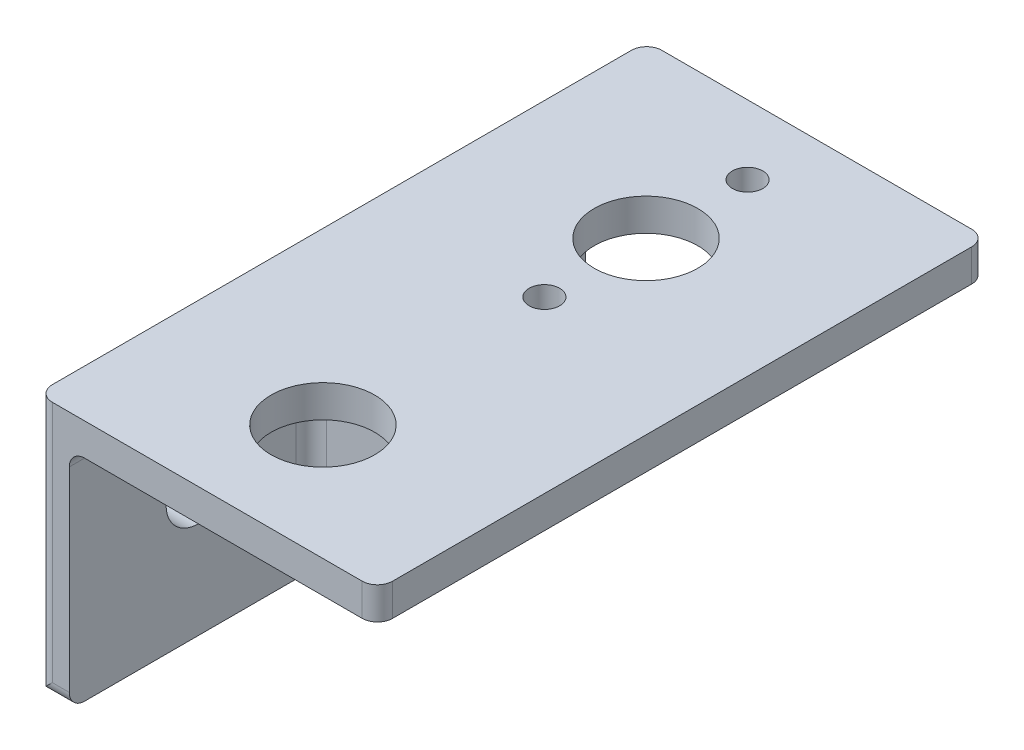
ISO-10303-21;
HEADER;
FILE_DESCRIPTION(('STEP AP214'),'2;1');
FILE_NAME('part.step','',(''),(''),'','','');
FILE_SCHEMA(('AUTOMOTIVE_DESIGN { 1 0 10303 214 1 1 1 1 }'));
ENDSEC;
DATA;
#1=APPLICATION_CONTEXT('core data for automotive mechanical design processes');
#2=APPLICATION_PROTOCOL_DEFINITION('international standard','automotive_design',2000,#1);
#3=PRODUCT_CONTEXT('',#1,'mechanical');
#4=PRODUCT('Part','Part','',(#3));
#5=PRODUCT_RELATED_PRODUCT_CATEGORY('part','',(#4));
#6=PRODUCT_DEFINITION_FORMATION('','',#4);
#7=PRODUCT_DEFINITION_CONTEXT('part definition',#1,'design');
#8=PRODUCT_DEFINITION('design','',#6,#7);
#9=PRODUCT_DEFINITION_SHAPE('','',#8);
#10=(LENGTH_UNIT() NAMED_UNIT(*) SI_UNIT(.MILLI.,.METRE.));
#11=(NAMED_UNIT(*) PLANE_ANGLE_UNIT() SI_UNIT($,.RADIAN.));
#12=(NAMED_UNIT(*) SI_UNIT($,.STERADIAN.) SOLID_ANGLE_UNIT());
#13=UNCERTAINTY_MEASURE_WITH_UNIT(LENGTH_MEASURE(1.E-05),#10,'distance_accuracy_value','');
#14=(GEOMETRIC_REPRESENTATION_CONTEXT(3) GLOBAL_UNCERTAINTY_ASSIGNED_CONTEXT((#13)) GLOBAL_UNIT_ASSIGNED_CONTEXT((#10,
#11,#12)) REPRESENTATION_CONTEXT('',''));
#15=CARTESIAN_POINT('',(0.,0.,0.));
#16=DIRECTION('',(0.,0.,1.));
#17=DIRECTION('',(1.,0.,0.));
#18=AXIS2_PLACEMENT_3D('',#15,#16,#17);
#19=CARTESIAN_POINT('',(3.175,0.,0.));
#20=DIRECTION('',(-1.,0.,0.));
#21=DIRECTION('',(0.,0.,1.));
#22=AXIS2_PLACEMENT_3D('',#19,#20,#21);
#23=PLANE('',#22);
#24=CARTESIAN_POINT('',(3.175,0.,12.7));
#25=DIRECTION('',(-1.,0.,0.));
#26=DIRECTION('',(0.,0.,1.));
#27=AXIS2_PLACEMENT_3D('',#24,#25,#26);
#28=CIRCLE('',#27,3.175);
#29=CARTESIAN_POINT('',(3.175,0.,15.875));
#30=VERTEX_POINT('',#29);
#31=EDGE_CURVE('E459',#30,#30,#28,.T.);
#32=ORIENTED_EDGE('',*,*,#31,.T.);
#33=EDGE_LOOP('',(#32));
#34=FACE_BOUND('',#33,.T.);
#35=DIRECTION('',(0.,-1.,0.));
#36=VECTOR('',#35,1.);
#37=CARTESIAN_POINT('',(3.175,-12.7,25.4));
#38=LINE('',#37,#36);
#39=CARTESIAN_POINT('',(3.175,8.02500000000001,25.4));
#40=VERTEX_POINT('',#39);
#41=CARTESIAN_POINT('',(3.175,-11.2,25.4));
#42=VERTEX_POINT('',#41);
#43=EDGE_CURVE('E221',#40,#42,#38,.T.);
#44=ORIENTED_EDGE('',*,*,#43,.T.);
#45=CARTESIAN_POINT('',(3.175,-11.2,23.9));
#46=DIRECTION('',(-1.,0.,0.));
#47=DIRECTION('',(0.,0.,1.));
#48=AXIS2_PLACEMENT_3D('',#45,#46,#47);
#49=CIRCLE('',#48,1.5);
#50=CARTESIAN_POINT('',(3.175,-12.7,23.9));
#51=VERTEX_POINT('',#50);
#52=EDGE_CURVE('E226',#42,#51,#49,.F.);
#53=ORIENTED_EDGE('',*,*,#52,.T.);
#54=DIRECTION('',(0.,0.,-1.));
#55=VECTOR('',#54,1.);
#56=CARTESIAN_POINT('',(3.175,-12.7,25.4));
#57=LINE('',#56,#55);
#58=CARTESIAN_POINT('',(3.175,-12.7,3.0875));
#59=VERTEX_POINT('',#58);
#60=EDGE_CURVE('E410',#51,#59,#57,.T.);
#61=ORIENTED_EDGE('',*,*,#60,.T.);
#62=DIRECTION('',(0.,-1.,0.));
#63=VECTOR('',#62,1.);
#64=CARTESIAN_POINT('',(3.175,9.52500000000001,3.0875));
#65=LINE('',#64,#63);
#66=CARTESIAN_POINT('',(3.175,8.02500000000001,3.0875));
#67=VERTEX_POINT('',#66);
#68=EDGE_CURVE('E223',#59,#67,#65,.F.);
#69=ORIENTED_EDGE('',*,*,#68,.T.);
#70=DIRECTION('',(0.,0.,-1.));
#71=VECTOR('',#70,1.);
#72=CARTESIAN_POINT('',(3.175,8.02500000000001,25.4));
#73=LINE('',#72,#71);
#74=EDGE_CURVE('E219',#67,#40,#73,.F.);
#75=ORIENTED_EDGE('',*,*,#74,.T.);
#76=EDGE_LOOP('',(#44,#53,#61,#69,#75));
#77=FACE_BOUND('',#76,.T.);
#78=ADVANCED_FACE('F33',(#34,#77),#23,.F.);
#79=CARTESIAN_POINT('',(0.,9.52500000000001,0.));
#80=DIRECTION('',(0.,1.,0.));
#81=DIRECTION('',(0.,0.,1.));
#82=AXIS2_PLACEMENT_3D('',#79,#80,#81);
#83=PLANE('',#82);
#84=CARTESIAN_POINT('',(16.75,9.52500000000001,14.0143792774836));
#85=DIRECTION('',(0.,1.,0.));
#86=DIRECTION('',(0.,0.,1.));
#87=AXIS2_PLACEMENT_3D('',#84,#85,#86);
#88=CIRCLE('',#87,5.1);
#89=CARTESIAN_POINT('',(16.75,9.52500000000001,19.1143792774836));
#90=VERTEX_POINT('',#89);
#91=EDGE_CURVE('E445',#90,#90,#88,.T.);
#92=ORIENTED_EDGE('',*,*,#91,.T.);
#93=EDGE_LOOP('',(#92));
#94=FACE_BOUND('',#93,.T.);
#95=CARTESIAN_POINT('',(16.75,9.52500000000001,-27.7881092855348));
#96=DIRECTION('',(0.,1.,0.));
#97=DIRECTION('',(0.,0.,1.));
#98=AXIS2_PLACEMENT_3D('',#95,#96,#97);
#99=CIRCLE('',#98,1.5);
#100=CARTESIAN_POINT('',(16.75,9.52500000000001,-26.2881092855348));
#101=VERTEX_POINT('',#100);
#102=EDGE_CURVE('E449',#101,#101,#99,.T.);
#103=ORIENTED_EDGE('',*,*,#102,.T.);
#104=EDGE_LOOP('',(#103));
#105=FACE_BOUND('',#104,.T.);
#106=CARTESIAN_POINT('',(16.75,9.52500000000001,-7.78810928553479));
#107=DIRECTION('',(0.,1.,0.));
#108=DIRECTION('',(0.,0.,1.));
#109=AXIS2_PLACEMENT_3D('',#106,#107,#108);
#110=CIRCLE('',#109,1.5);
#111=CARTESIAN_POINT('',(16.75,9.52500000000001,-6.28810928553479));
#112=VERTEX_POINT('',#111);
#113=EDGE_CURVE('E778',#112,#112,#110,.T.);
#114=ORIENTED_EDGE('',*,*,#113,.T.);
#115=EDGE_LOOP('',(#114));
#116=FACE_BOUND('',#115,.T.);
#117=CARTESIAN_POINT('',(16.75,9.52500000000001,-17.7881092855348));
#118=DIRECTION('',(0.,1.,0.));
#119=DIRECTION('',(0.,0.,1.));
#120=AXIS2_PLACEMENT_3D('',#117,#118,#119);
#121=CIRCLE('',#120,5.1);
#122=CARTESIAN_POINT('',(16.75,9.52500000000001,-12.6881092855348));
#123=VERTEX_POINT('',#122);
#124=EDGE_CURVE('E781',#123,#123,#121,.T.);
#125=ORIENTED_EDGE('',*,*,#124,.T.);
#126=EDGE_LOOP('',(#125));
#127=FACE_BOUND('',#126,.T.);
#128=DIRECTION('',(0.,0.,1.));
#129=VECTOR('',#128,1.);
#130=CARTESIAN_POINT('',(0.,9.52500000000001,-34.6));
#131=LINE('',#130,#129);
#132=CARTESIAN_POINT('',(0.,9.52500000000001,-33.1));
#133=VERTEX_POINT('',#132);
#134=CARTESIAN_POINT('',(0.,9.52500000000001,-25.4));
#135=VERTEX_POINT('',#134);
#136=EDGE_CURVE('E333',#133,#135,#131,.T.);
#137=ORIENTED_EDGE('',*,*,#136,.F.);
#138=CARTESIAN_POINT('',(1.5,9.52500000000001,-33.1));
#139=DIRECTION('',(0.,1.,0.));
#140=DIRECTION('',(0.,0.,1.));
#141=AXIS2_PLACEMENT_3D('',#138,#139,#140);
#142=CIRCLE('',#141,1.5);
#143=CARTESIAN_POINT('',(1.5,9.52500000000001,-34.6));
#144=VERTEX_POINT('',#143);
#145=EDGE_CURVE('E259',#133,#144,#142,.F.);
#146=ORIENTED_EDGE('',*,*,#145,.T.);
#147=DIRECTION('',(-1.,0.,0.));
#148=VECTOR('',#147,1.);
#149=CARTESIAN_POINT('',(0.,9.52500000000001,-34.6));
#150=LINE('',#149,#148);
#151=CARTESIAN_POINT('',(32.,9.52500000000001,-34.6));
#152=VERTEX_POINT('',#151);
#153=EDGE_CURVE('E402',#152,#144,#150,.T.);
#154=ORIENTED_EDGE('',*,*,#153,.F.);
#155=CARTESIAN_POINT('',(32.,9.52500000000001,-33.1));
#156=DIRECTION('',(0.,1.,0.));
#157=DIRECTION('',(0.,0.,1.));
#158=AXIS2_PLACEMENT_3D('',#155,#156,#157);
#159=CIRCLE('',#158,1.5);
#160=CARTESIAN_POINT('',(33.5,9.52500000000001,-33.1));
#161=VERTEX_POINT('',#160);
#162=EDGE_CURVE('E253',#152,#161,#159,.F.);
#163=ORIENTED_EDGE('',*,*,#162,.T.);
#164=DIRECTION('',(0.,0.,-1.));
#165=VECTOR('',#164,1.);
#166=CARTESIAN_POINT('',(33.5,9.52500000000001,-34.6));
#167=LINE('',#166,#165);
#168=CARTESIAN_POINT('',(33.5,9.52500000000001,23.9));
#169=VERTEX_POINT('',#168);
#170=EDGE_CURVE('E400',#169,#161,#167,.T.);
#171=ORIENTED_EDGE('',*,*,#170,.F.);
#172=CARTESIAN_POINT('',(32.,9.52500000000001,23.9));
#173=DIRECTION('',(0.,1.,0.));
#174=DIRECTION('',(0.,0.,1.));
#175=AXIS2_PLACEMENT_3D('',#172,#173,#174);
#176=CIRCLE('',#175,1.5);
#177=CARTESIAN_POINT('',(32.,9.52500000000001,25.4));
#178=VERTEX_POINT('',#177);
#179=EDGE_CURVE('E256',#169,#178,#176,.F.);
#180=ORIENTED_EDGE('',*,*,#179,.T.);
#181=DIRECTION('',(1.,0.,0.));
#182=VECTOR('',#181,1.);
#183=CARTESIAN_POINT('',(0.,9.52500000000001,25.4));
#184=LINE('',#183,#182);
#185=CARTESIAN_POINT('',(4.675,9.52500000000001,25.4));
#186=VERTEX_POINT('',#185);
#187=EDGE_CURVE('E348',#186,#178,#184,.T.);
#188=ORIENTED_EDGE('',*,*,#187,.F.);
#189=DIRECTION('',(0.,0.,-1.));
#190=VECTOR('',#189,1.);
#191=CARTESIAN_POINT('',(4.675,9.52500000000001,1.5875));
#192=LINE('',#191,#190);
#193=CARTESIAN_POINT('',(4.675,9.52500000000001,3.0875));
#194=VERTEX_POINT('',#193);
#195=EDGE_CURVE('E240',#186,#194,#192,.T.);
#196=ORIENTED_EDGE('',*,*,#195,.T.);
#197=DIRECTION('',(-1.,0.,0.));
#198=VECTOR('',#197,1.);
#199=CARTESIAN_POINT('',(25.3999999999999,9.52500000000001,3.0875));
#200=LINE('',#199,#198);
#201=CARTESIAN_POINT('',(26.0213203435596,9.52500000000001,3.0875));
#202=VERTEX_POINT('',#201);
#203=EDGE_CURVE('E145',#194,#202,#200,.F.);
#204=ORIENTED_EDGE('',*,*,#203,.T.);
#205=DIRECTION('',(0.,0.,-1.));
#206=VECTOR('',#205,1.);
#207=CARTESIAN_POINT('',(26.0213203435596,9.52500000000001,-1.5875));
#208=LINE('',#207,#206);
#209=CARTESIAN_POINT('',(26.0213203435596,9.52500000000001,-3.0875));
#210=VERTEX_POINT('',#209);
#211=EDGE_CURVE('E205',#202,#210,#208,.T.);
#212=ORIENTED_EDGE('',*,*,#211,.T.);
#213=DIRECTION('',(-1.,0.,0.));
#214=VECTOR('',#213,1.);
#215=CARTESIAN_POINT('',(0.,9.52500000000001,-3.0875));
#216=LINE('',#215,#214);
#217=CARTESIAN_POINT('',(4.675,9.52500000000001,-3.0875));
#218=VERTEX_POINT('',#217);
#219=EDGE_CURVE('E176',#210,#218,#216,.T.);
#220=ORIENTED_EDGE('',*,*,#219,.T.);
#221=DIRECTION('',(0.,0.,-1.));
#222=VECTOR('',#221,1.);
#223=CARTESIAN_POINT('',(4.675,9.52500000000001,-25.4));
#224=LINE('',#223,#222);
#225=CARTESIAN_POINT('',(4.675,9.52500000000001,-25.4));
#226=VERTEX_POINT('',#225);
#227=EDGE_CURVE('E250',#218,#226,#224,.T.);
#228=ORIENTED_EDGE('',*,*,#227,.T.);
#229=DIRECTION('',(-1.,0.,0.));
#230=VECTOR('',#229,1.);
#231=CARTESIAN_POINT('',(3.175,9.52500000000001,-25.4));
#232=LINE('',#231,#230);
#233=EDGE_CURVE('E347',#226,#135,#232,.T.);
#234=ORIENTED_EDGE('',*,*,#233,.T.);
#235=EDGE_LOOP('',(#137,#146,#154,#163,#171,#180,#188,#196,#204,#212,#220,#228,#234));
#236=FACE_BOUND('',#235,.T.);
#237=ADVANCED_FACE('F343',(#94,#105,#116,#127,#236),#83,.F.);
#238=CARTESIAN_POINT('',(3.175,-12.7,-25.4));
#239=DIRECTION('',(0.,0.,1.));
#240=DIRECTION('',(1.,0.,0.));
#241=AXIS2_PLACEMENT_3D('',#238,#239,#240);
#242=PLANE('',#241);
#243=DIRECTION('',(0.,1.,0.));
#244=VECTOR('',#243,1.);
#245=CARTESIAN_POINT('',(3.175,-12.7,-25.4));
#246=LINE('',#245,#244);
#247=CARTESIAN_POINT('',(3.175,-11.2,-25.4));
#248=VERTEX_POINT('',#247);
#249=CARTESIAN_POINT('',(3.175,8.02500000000001,-25.4));
#250=VERTEX_POINT('',#249);
#251=EDGE_CURVE('E236',#248,#250,#246,.T.);
#252=ORIENTED_EDGE('',*,*,#251,.F.);
#253=DIRECTION('',(-1.,0.,0.));
#254=VECTOR('',#253,1.);
#255=CARTESIAN_POINT('',(3.175,-11.2,-25.4));
#256=LINE('',#255,#254);
#257=CARTESIAN_POINT('',(0.,-11.2,-25.4));
#258=VERTEX_POINT('',#257);
#259=EDGE_CURVE('E281',#248,#258,#256,.T.);
#260=ORIENTED_EDGE('',*,*,#259,.T.);
#261=DIRECTION('',(0.,1.,0.));
#262=VECTOR('',#261,1.);
#263=CARTESIAN_POINT('',(0.,-12.7,-25.4));
#264=LINE('',#263,#262);
#265=EDGE_CURVE('E408',#258,#135,#264,.T.);
#266=ORIENTED_EDGE('',*,*,#265,.T.);
#267=ORIENTED_EDGE('',*,*,#233,.F.);
#268=CARTESIAN_POINT('',(4.675,8.02500000000001,-25.4));
#269=DIRECTION('',(0.,0.,1.));
#270=DIRECTION('',(1.,0.,0.));
#271=AXIS2_PLACEMENT_3D('',#268,#269,#270);
#272=CIRCLE('',#271,1.5);
#273=EDGE_CURVE('E190',#226,#250,#272,.T.);
#274=ORIENTED_EDGE('',*,*,#273,.T.);
#275=EDGE_LOOP('',(#252,#260,#266,#267,#274));
#276=FACE_BOUND('',#275,.T.);
#277=ADVANCED_FACE('F299',(#276),#242,.F.);
#278=CARTESIAN_POINT('',(3.175,0.,-12.7));
#279=DIRECTION('',(-1.,0.,0.));
#280=DIRECTION('',(0.,0.,1.));
#281=AXIS2_PLACEMENT_3D('',#278,#279,#280);
#282=CIRCLE('',#281,3.175);
#283=CARTESIAN_POINT('',(3.175,0.,-9.525));
#284=VERTEX_POINT('',#283);
#285=EDGE_CURVE('E395',#284,#284,#282,.T.);
#286=ORIENTED_EDGE('',*,*,#285,.T.);
#287=EDGE_LOOP('',(#286));
#288=FACE_BOUND('',#287,.T.);
#289=CARTESIAN_POINT('',(3.175,-12.7,-3.0875));
#290=VERTEX_POINT('',#289);
#291=CARTESIAN_POINT('',(3.175,-12.7,-23.9));
#292=VERTEX_POINT('',#291);
#293=EDGE_CURVE('E235',#290,#292,#57,.T.);
#294=ORIENTED_EDGE('',*,*,#293,.T.);
#295=CARTESIAN_POINT('',(3.175,-11.2,-23.9));
#296=DIRECTION('',(-1.,0.,0.));
#297=DIRECTION('',(0.,0.,1.));
#298=AXIS2_PLACEMENT_3D('',#295,#296,#297);
#299=CIRCLE('',#298,1.5);
#300=EDGE_CURVE('E288',#292,#248,#299,.F.);
#301=ORIENTED_EDGE('',*,*,#300,.T.);
#302=ORIENTED_EDGE('',*,*,#251,.T.);
#303=DIRECTION('',(0.,0.,-1.));
#304=VECTOR('',#303,1.);
#305=CARTESIAN_POINT('',(3.175,8.02500000000001,-1.5875));
#306=LINE('',#305,#304);
#307=CARTESIAN_POINT('',(3.175,8.02500000000001,-3.0875));
#308=VERTEX_POINT('',#307);
#309=EDGE_CURVE('E284',#250,#308,#306,.F.);
#310=ORIENTED_EDGE('',*,*,#309,.T.);
#311=DIRECTION('',(0.,-1.,0.));
#312=VECTOR('',#311,1.);
#313=CARTESIAN_POINT('',(3.175,0.,-3.0875));
#314=LINE('',#313,#312);
#315=EDGE_CURVE('E286',#308,#290,#314,.T.);
#316=ORIENTED_EDGE('',*,*,#315,.T.);
#317=EDGE_LOOP('',(#294,#301,#302,#310,#316));
#318=FACE_BOUND('',#317,.T.);
#319=ADVANCED_FACE('F294',(#288,#318),#23,.F.);
#320=CARTESIAN_POINT('',(3.175,12.7,25.4));
#321=DIRECTION('',(0.,-1.,0.));
#322=DIRECTION('',(0.,0.,-1.));
#323=AXIS2_PLACEMENT_3D('',#320,#321,#322);
#324=PLANE('',#323);
#325=CARTESIAN_POINT('',(16.75,12.7,14.0143792774836));
#326=DIRECTION('',(0.,1.,0.));
#327=DIRECTION('',(0.,0.,1.));
#328=AXIS2_PLACEMENT_3D('',#325,#326,#327);
#329=CIRCLE('',#328,5.1);
#330=CARTESIAN_POINT('',(16.75,12.7,19.1143792774836));
#331=VERTEX_POINT('',#330);
#332=EDGE_CURVE('E197',#331,#331,#329,.T.);
#333=ORIENTED_EDGE('',*,*,#332,.F.);
#334=EDGE_LOOP('',(#333));
#335=FACE_BOUND('',#334,.T.);
#336=CARTESIAN_POINT('',(16.75,12.7,-27.7881092855348));
#337=DIRECTION('',(0.,1.,0.));
#338=DIRECTION('',(0.,0.,1.));
#339=AXIS2_PLACEMENT_3D('',#336,#337,#338);
#340=CIRCLE('',#339,1.5);
#341=CARTESIAN_POINT('',(16.75,12.7,-26.2881092855348));
#342=VERTEX_POINT('',#341);
#343=EDGE_CURVE('E792',#342,#342,#340,.T.);
#344=ORIENTED_EDGE('',*,*,#343,.F.);
#345=EDGE_LOOP('',(#344));
#346=FACE_BOUND('',#345,.T.);
#347=CARTESIAN_POINT('',(16.75,12.7,-7.78810928553479));
#348=DIRECTION('',(0.,1.,0.));
#349=DIRECTION('',(0.,0.,1.));
#350=AXIS2_PLACEMENT_3D('',#347,#348,#349);
#351=CIRCLE('',#350,1.5);
#352=CARTESIAN_POINT('',(16.75,12.7,-6.28810928553479));
#353=VERTEX_POINT('',#352);
#354=EDGE_CURVE('E787',#353,#353,#351,.T.);
#355=ORIENTED_EDGE('',*,*,#354,.F.);
#356=EDGE_LOOP('',(#355));
#357=FACE_BOUND('',#356,.T.);
#358=CARTESIAN_POINT('',(16.75,12.7,-17.7881092855348));
#359=DIRECTION('',(0.,1.,0.));
#360=DIRECTION('',(0.,0.,1.));
#361=AXIS2_PLACEMENT_3D('',#358,#359,#360);
#362=CIRCLE('',#361,5.1);
#363=CARTESIAN_POINT('',(16.75,12.7,-12.6881092855348));
#364=VERTEX_POINT('',#363);
#365=EDGE_CURVE('E783',#364,#364,#362,.T.);
#366=ORIENTED_EDGE('',*,*,#365,.F.);
#367=EDGE_LOOP('',(#366));
#368=FACE_BOUND('',#367,.T.);
#369=DIRECTION('',(-1.,0.,0.));
#370=VECTOR('',#369,1.);
#371=CARTESIAN_POINT('',(0.,12.7,-34.6));
#372=LINE('',#371,#370);
#373=CARTESIAN_POINT('',(32.,12.7,-34.6));
#374=VERTEX_POINT('',#373);
#375=CARTESIAN_POINT('',(1.5,12.7,-34.6));
#376=VERTEX_POINT('',#375);
#377=EDGE_CURVE('E349',#374,#376,#372,.T.);
#378=ORIENTED_EDGE('',*,*,#377,.T.);
#379=CARTESIAN_POINT('',(1.5,12.7,-33.1));
#380=DIRECTION('',(0.,-1.,0.));
#381=DIRECTION('',(0.,0.,-1.));
#382=AXIS2_PLACEMENT_3D('',#379,#380,#381);
#383=CIRCLE('',#382,1.5);
#384=CARTESIAN_POINT('',(0.,12.7,-33.1));
#385=VERTEX_POINT('',#384);
#386=EDGE_CURVE('E318',#376,#385,#383,.F.);
#387=ORIENTED_EDGE('',*,*,#386,.T.);
#388=DIRECTION('',(0.,0.,1.));
#389=VECTOR('',#388,1.);
#390=CARTESIAN_POINT('',(0.,12.7,25.4));
#391=LINE('',#390,#389);
#392=CARTESIAN_POINT('',(0.,12.7,23.9));
#393=VERTEX_POINT('',#392);
#394=EDGE_CURVE('E337',#385,#393,#391,.T.);
#395=ORIENTED_EDGE('',*,*,#394,.T.);
#396=CARTESIAN_POINT('',(1.5,12.7,23.9));
#397=DIRECTION('',(0.,-1.,0.));
#398=DIRECTION('',(0.,0.,-1.));
#399=AXIS2_PLACEMENT_3D('',#396,#397,#398);
#400=CIRCLE('',#399,1.5);
#401=CARTESIAN_POINT('',(1.5,12.7,25.4));
#402=VERTEX_POINT('',#401);
#403=EDGE_CURVE('E361',#393,#402,#400,.F.);
#404=ORIENTED_EDGE('',*,*,#403,.T.);
#405=DIRECTION('',(-1.,0.,0.));
#406=VECTOR('',#405,1.);
#407=CARTESIAN_POINT('',(3.175,12.7,25.4));
#408=LINE('',#407,#406);
#409=CARTESIAN_POINT('',(32.,12.7,25.4));
#410=VERTEX_POINT('',#409);
#411=EDGE_CURVE('E368',#410,#402,#408,.T.);
#412=ORIENTED_EDGE('',*,*,#411,.F.);
#413=CARTESIAN_POINT('',(32.,12.7,23.9));
#414=DIRECTION('',(0.,-1.,0.));
#415=DIRECTION('',(0.,0.,-1.));
#416=AXIS2_PLACEMENT_3D('',#413,#414,#415);
#417=CIRCLE('',#416,1.5);
#418=CARTESIAN_POINT('',(33.5,12.7,23.9));
#419=VERTEX_POINT('',#418);
#420=EDGE_CURVE('E323',#410,#419,#417,.F.);
#421=ORIENTED_EDGE('',*,*,#420,.T.);
#422=DIRECTION('',(0.,0.,-1.));
#423=VECTOR('',#422,1.);
#424=CARTESIAN_POINT('',(33.5,12.7,-34.6));
#425=LINE('',#424,#423);
#426=CARTESIAN_POINT('',(33.5,12.7,-33.1));
#427=VERTEX_POINT('',#426);
#428=EDGE_CURVE('E381',#419,#427,#425,.T.);
#429=ORIENTED_EDGE('',*,*,#428,.T.);
#430=CARTESIAN_POINT('',(32.,12.7,-33.1));
#431=DIRECTION('',(0.,-1.,0.));
#432=DIRECTION('',(0.,0.,-1.));
#433=AXIS2_PLACEMENT_3D('',#430,#431,#432);
#434=CIRCLE('',#433,1.5);
#435=EDGE_CURVE('E365',#427,#374,#434,.F.);
#436=ORIENTED_EDGE('',*,*,#435,.T.);
#437=EDGE_LOOP('',(#378,#387,#395,#404,#412,#421,#429,#436));
#438=FACE_BOUND('',#437,.T.);
#439=ADVANCED_FACE('F380',(#335,#346,#357,#368,#438),#324,.F.);
#440=CARTESIAN_POINT('',(3.175,-12.7,25.4));
#441=DIRECTION('',(0.,0.,-1.));
#442=DIRECTION('',(-1.,0.,0.));
#443=AXIS2_PLACEMENT_3D('',#440,#441,#442);
#444=PLANE('',#443);
#445=ORIENTED_EDGE('',*,*,#187,.T.);
#446=DIRECTION('',(0.,1.,0.));
#447=VECTOR('',#446,1.);
#448=CARTESIAN_POINT('',(32.,12.7,25.4));
#449=LINE('',#448,#447);
#450=EDGE_CURVE('E265',#178,#410,#449,.T.);
#451=ORIENTED_EDGE('',*,*,#450,.T.);
#452=ORIENTED_EDGE('',*,*,#411,.T.);
#453=DIRECTION('',(0.,-1.,0.));
#454=VECTOR('',#453,1.);
#455=CARTESIAN_POINT('',(1.5,-12.7,25.4));
#456=LINE('',#455,#454);
#457=CARTESIAN_POINT('',(1.5,-11.2,25.4));
#458=VERTEX_POINT('',#457);
#459=EDGE_CURVE('E263',#402,#458,#456,.T.);
#460=ORIENTED_EDGE('',*,*,#459,.T.);
#461=DIRECTION('',(-1.,0.,0.));
#462=VECTOR('',#461,1.);
#463=CARTESIAN_POINT('',(3.175,-11.2,25.4));
#464=LINE('',#463,#462);
#465=EDGE_CURVE('E234',#458,#42,#464,.F.);
#466=ORIENTED_EDGE('',*,*,#465,.T.);
#467=ORIENTED_EDGE('',*,*,#43,.F.);
#468=CARTESIAN_POINT('',(4.675,8.02500000000001,25.4));
#469=DIRECTION('',(0.,0.,-1.));
#470=DIRECTION('',(-1.,0.,0.));
#471=AXIS2_PLACEMENT_3D('',#468,#469,#470);
#472=CIRCLE('',#471,1.5);
#473=EDGE_CURVE('E192',#40,#186,#472,.T.);
#474=ORIENTED_EDGE('',*,*,#473,.T.);
#475=EDGE_LOOP('',(#445,#451,#452,#460,#466,#467,#474));
#476=FACE_BOUND('',#475,.T.);
#477=ADVANCED_FACE('F230',(#476),#444,.F.);
#478=CARTESIAN_POINT('',(3.175,-12.7,25.4));
#479=DIRECTION('',(0.,1.,0.));
#480=DIRECTION('',(0.,0.,1.));
#481=AXIS2_PLACEMENT_3D('',#478,#479,#480);
#482=PLANE('',#481);
#483=ORIENTED_EDGE('',*,*,#60,.F.);
#484=DIRECTION('',(-1.,0.,0.));
#485=VECTOR('',#484,1.);
#486=CARTESIAN_POINT('',(3.175,-12.7,23.9));
#487=LINE('',#486,#485);
#488=CARTESIAN_POINT('',(0.,-12.7,23.9));
#489=VERTEX_POINT('',#488);
#490=EDGE_CURVE('E276',#51,#489,#487,.T.);
#491=ORIENTED_EDGE('',*,*,#490,.T.);
#492=DIRECTION('',(0.,0.,-1.));
#493=VECTOR('',#492,1.);
#494=CARTESIAN_POINT('',(0.,-12.7,25.4));
#495=LINE('',#494,#493);
#496=CARTESIAN_POINT('',(0.,-12.7,-23.9));
#497=VERTEX_POINT('',#496);
#498=EDGE_CURVE('E304',#489,#497,#495,.T.);
#499=ORIENTED_EDGE('',*,*,#498,.T.);
#500=DIRECTION('',(-1.,0.,0.));
#501=VECTOR('',#500,1.);
#502=CARTESIAN_POINT('',(3.175,-12.7,-23.9));
#503=LINE('',#502,#501);
#504=EDGE_CURVE('E274',#497,#292,#503,.F.);
#505=ORIENTED_EDGE('',*,*,#504,.T.);
#506=ORIENTED_EDGE('',*,*,#293,.F.);
#507=DIRECTION('',(0.,0.,-1.));
#508=VECTOR('',#507,1.);
#509=CARTESIAN_POINT('',(3.175,-12.7,1.5875));
#510=LINE('',#509,#508);
#511=EDGE_CURVE('E50',#59,#290,#510,.T.);
#512=ORIENTED_EDGE('',*,*,#511,.F.);
#513=EDGE_LOOP('',(#483,#491,#499,#505,#506,#512));
#514=FACE_BOUND('',#513,.T.);
#515=ADVANCED_FACE('F467',(#514),#482,.F.);
#516=CARTESIAN_POINT('',(0.,0.,0.));
#517=DIRECTION('',(-1.,0.,0.));
#518=DIRECTION('',(0.,0.,1.));
#519=AXIS2_PLACEMENT_3D('',#516,#517,#518);
#520=PLANE('',#519);
#521=CARTESIAN_POINT('',(0.,0.,-12.7));
#522=DIRECTION('',(-1.,0.,0.));
#523=DIRECTION('',(0.,0.,1.));
#524=AXIS2_PLACEMENT_3D('',#521,#522,#523);
#525=CIRCLE('',#524,3.175);
#526=CARTESIAN_POINT('',(0.,0.,-9.525));
#527=VERTEX_POINT('',#526);
#528=EDGE_CURVE('E456',#527,#527,#525,.T.);
#529=ORIENTED_EDGE('',*,*,#528,.F.);
#530=EDGE_LOOP('',(#529));
#531=FACE_BOUND('',#530,.T.);
#532=CARTESIAN_POINT('',(0.,0.,12.7));
#533=DIRECTION('',(-1.,0.,0.));
#534=DIRECTION('',(0.,0.,1.));
#535=AXIS2_PLACEMENT_3D('',#532,#533,#534);
#536=CIRCLE('',#535,3.175);
#537=CARTESIAN_POINT('',(0.,0.,15.875));
#538=VERTEX_POINT('',#537);
#539=EDGE_CURVE('E453',#538,#538,#536,.T.);
#540=ORIENTED_EDGE('',*,*,#539,.F.);
#541=EDGE_LOOP('',(#540));
#542=FACE_BOUND('',#541,.T.);
#543=ORIENTED_EDGE('',*,*,#394,.F.);
#544=DIRECTION('',(0.,1.,0.));
#545=VECTOR('',#544,1.);
#546=CARTESIAN_POINT('',(0.,0.,-33.1));
#547=LINE('',#546,#545);
#548=EDGE_CURVE('E245',#385,#133,#547,.F.);
#549=ORIENTED_EDGE('',*,*,#548,.T.);
#550=ORIENTED_EDGE('',*,*,#136,.T.);
#551=ORIENTED_EDGE('',*,*,#265,.F.);
#552=CARTESIAN_POINT('',(0.,-11.2,-23.9));
#553=DIRECTION('',(-1.,0.,0.));
#554=DIRECTION('',(0.,0.,1.));
#555=AXIS2_PLACEMENT_3D('',#552,#553,#554);
#556=CIRCLE('',#555,1.5);
#557=EDGE_CURVE('E309',#258,#497,#556,.T.);
#558=ORIENTED_EDGE('',*,*,#557,.T.);
#559=ORIENTED_EDGE('',*,*,#498,.F.);
#560=DIRECTION('',(0.,-1.,0.));
#561=VECTOR('',#560,1.);
#562=CARTESIAN_POINT('',(0.,12.7,23.9));
#563=LINE('',#562,#561);
#564=EDGE_CURVE('E317',#489,#393,#563,.F.);
#565=ORIENTED_EDGE('',*,*,#564,.T.);
#566=EDGE_LOOP('',(#543,#549,#550,#551,#558,#559,#565));
#567=FACE_BOUND('',#566,.T.);
#568=ADVANCED_FACE('F331',(#531,#542,#567),#520,.T.);
#569=CARTESIAN_POINT('',(0.,9.52500000000001,-34.6));
#570=DIRECTION('',(0.,0.,-1.));
#571=DIRECTION('',(-1.,0.,0.));
#572=AXIS2_PLACEMENT_3D('',#569,#570,#571);
#573=PLANE('',#572);
#574=ORIENTED_EDGE('',*,*,#153,.T.);
#575=DIRECTION('',(0.,1.,0.));
#576=VECTOR('',#575,1.);
#577=CARTESIAN_POINT('',(1.5,9.52500000000001,-34.6));
#578=LINE('',#577,#576);
#579=EDGE_CURVE('E354',#144,#376,#578,.T.);
#580=ORIENTED_EDGE('',*,*,#579,.T.);
#581=ORIENTED_EDGE('',*,*,#377,.F.);
#582=DIRECTION('',(0.,1.,0.));
#583=VECTOR('',#582,1.);
#584=CARTESIAN_POINT('',(32.,9.52500000000001,-34.6));
#585=LINE('',#584,#583);
#586=EDGE_CURVE('E362',#374,#152,#585,.F.);
#587=ORIENTED_EDGE('',*,*,#586,.T.);
#588=EDGE_LOOP('',(#574,#580,#581,#587));
#589=FACE_BOUND('',#588,.T.);
#590=ADVANCED_FACE('F433',(#589),#573,.T.);
#591=CARTESIAN_POINT('',(33.5,9.52500000000001,-34.6));
#592=DIRECTION('',(1.,0.,0.));
#593=DIRECTION('',(0.,0.,-1.));
#594=AXIS2_PLACEMENT_3D('',#591,#592,#593);
#595=PLANE('',#594);
#596=ORIENTED_EDGE('',*,*,#428,.F.);
#597=DIRECTION('',(0.,1.,0.));
#598=VECTOR('',#597,1.);
#599=CARTESIAN_POINT('',(33.5,9.52500000000001,23.9));
#600=LINE('',#599,#598);
#601=EDGE_CURVE('E271',#419,#169,#600,.F.);
#602=ORIENTED_EDGE('',*,*,#601,.T.);
#603=ORIENTED_EDGE('',*,*,#170,.T.);
#604=DIRECTION('',(0.,1.,0.));
#605=VECTOR('',#604,1.);
#606=CARTESIAN_POINT('',(33.5,9.52500000000001,-33.1));
#607=LINE('',#606,#605);
#608=EDGE_CURVE('E268',#161,#427,#607,.T.);
#609=ORIENTED_EDGE('',*,*,#608,.T.);
#610=EDGE_LOOP('',(#596,#602,#603,#609));
#611=FACE_BOUND('',#610,.T.);
#612=ADVANCED_FACE('F390',(#611),#595,.T.);
#613=CARTESIAN_POINT('',(3.175,0.,12.7));
#614=DIRECTION('',(-1.,0.,0.));
#615=DIRECTION('',(0.,0.,1.));
#616=AXIS2_PLACEMENT_3D('',#613,#614,#615);
#617=CYLINDRICAL_SURFACE('',#616,3.175);
#618=ORIENTED_EDGE('',*,*,#31,.F.);
#619=EDGE_LOOP('',(#618));
#620=FACE_BOUND('',#619,.T.);
#621=ORIENTED_EDGE('',*,*,#539,.T.);
#622=EDGE_LOOP('',(#621));
#623=FACE_BOUND('',#622,.T.);
#624=ADVANCED_FACE('F464',(#620,#623),#617,.F.);
#625=CARTESIAN_POINT('',(3.175,0.,-12.7));
#626=DIRECTION('',(-1.,0.,0.));
#627=DIRECTION('',(0.,0.,1.));
#628=AXIS2_PLACEMENT_3D('',#625,#626,#627);
#629=CYLINDRICAL_SURFACE('',#628,3.175);
#630=ORIENTED_EDGE('',*,*,#285,.F.);
#631=EDGE_LOOP('',(#630));
#632=FACE_BOUND('',#631,.T.);
#633=ORIENTED_EDGE('',*,*,#528,.T.);
#634=EDGE_LOOP('',(#633));
#635=FACE_BOUND('',#634,.T.);
#636=ADVANCED_FACE('F497',(#632,#635),#629,.F.);
#637=CARTESIAN_POINT('',(3.175,-12.7,1.5875));
#638=DIRECTION('',(-0.707106781186549,0.707106781186546,0.));
#639=DIRECTION('',(-0.707106781186546,-0.707106781186549,0.));
#640=AXIS2_PLACEMENT_3D('',#637,#638,#639);
#641=PLANE('',#640);
#642=DIRECTION('',(0.707106781186546,0.707106781186549,0.));
#643=VECTOR('',#642,1.);
#644=CARTESIAN_POINT('',(3.175,-12.7,-1.5875));
#645=LINE('',#644,#643);
#646=CARTESIAN_POINT('',(4.675,-11.2,-1.5875));
#647=VERTEX_POINT('',#646);
#648=CARTESIAN_POINT('',(23.8999999999999,8.025,-1.5875));
#649=VERTEX_POINT('',#648);
#650=EDGE_CURVE('E443',#647,#649,#645,.T.);
#651=ORIENTED_EDGE('',*,*,#650,.T.);
#652=CARTESIAN_POINT('',(23.8999999999999,8.02500000000001,-3.0875));
#653=DIRECTION('',(-0.707106781186549,0.707106781186546,0.));
#654=DIRECTION('',(-0.707106781186546,-0.707106781186549,0.));
#655=AXIS2_PLACEMENT_3D('',#652,#653,#654);
#656=ELLIPSE('',#655,2.12132034355964,1.5);
#657=CARTESIAN_POINT('',(24.9606601717797,9.08566017177982,-2.02683982822018));
#658=VERTEX_POINT('',#657);
#659=EDGE_CURVE('E124',#649,#658,#656,.T.);
#660=ORIENTED_EDGE('',*,*,#659,.T.);
#661=DIRECTION('',(0.,0.,-1.));
#662=VECTOR('',#661,1.);
#663=CARTESIAN_POINT('',(24.9606601717797,9.08566017177982,1.5875));
#664=LINE('',#663,#662);
#665=CARTESIAN_POINT('',(24.9606601717797,9.08566017177982,2.02683982822018));
#666=VERTEX_POINT('',#665);
#667=EDGE_CURVE('E59',#658,#666,#664,.F.);
#668=ORIENTED_EDGE('',*,*,#667,.T.);
#669=CARTESIAN_POINT('',(23.8999999999999,8.02500000000001,3.0875));
#670=DIRECTION('',(-0.707106781186549,0.707106781186546,0.));
#671=DIRECTION('',(0.707106781186546,0.707106781186549,0.));
#672=AXIS2_PLACEMENT_3D('',#669,#670,#671);
#673=ELLIPSE('',#672,2.12132034355964,1.5);
#674=CARTESIAN_POINT('',(23.8999999999999,8.025,1.5875));
#675=VERTEX_POINT('',#674);
#676=EDGE_CURVE('E42',#666,#675,#673,.T.);
#677=ORIENTED_EDGE('',*,*,#676,.T.);
#678=DIRECTION('',(0.707106781186546,0.707106781186549,0.));
#679=VECTOR('',#678,1.);
#680=CARTESIAN_POINT('',(3.175,-12.7,1.5875));
#681=LINE('',#680,#679);
#682=CARTESIAN_POINT('',(4.675,-11.2,1.5875));
#683=VERTEX_POINT('',#682);
#684=EDGE_CURVE('E121',#683,#675,#681,.T.);
#685=ORIENTED_EDGE('',*,*,#684,.F.);
#686=CARTESIAN_POINT('',(4.675,-11.2,3.0875));
#687=DIRECTION('',(-0.707106781186549,0.707106781186546,0.));
#688=DIRECTION('',(0.707106781186546,0.707106781186549,0.));
#689=AXIS2_PLACEMENT_3D('',#686,#687,#688);
#690=ELLIPSE('',#689,2.12132034355965,1.5);
#691=EDGE_CURVE('E11',#683,#59,#690,.T.);
#692=ORIENTED_EDGE('',*,*,#691,.T.);
#693=ORIENTED_EDGE('',*,*,#511,.T.);
#694=CARTESIAN_POINT('',(4.675,-11.2,-3.0875));
#695=DIRECTION('',(-0.707106781186549,0.707106781186546,0.));
#696=DIRECTION('',(-0.707106781186546,-0.707106781186549,0.));
#697=AXIS2_PLACEMENT_3D('',#694,#695,#696);
#698=ELLIPSE('',#697,2.12132034355965,1.5);
#699=EDGE_CURVE('E188',#290,#647,#698,.T.);
#700=ORIENTED_EDGE('',*,*,#699,.T.);
#701=EDGE_LOOP('',(#651,#660,#668,#677,#685,#692,#693,#700));
#702=FACE_BOUND('',#701,.T.);
#703=ADVANCED_FACE('F442',(#702),#641,.F.);
#704=CARTESIAN_POINT('',(0.,0.,1.5875));
#705=DIRECTION('',(0.,0.,-1.));
#706=DIRECTION('',(-1.,0.,0.));
#707=AXIS2_PLACEMENT_3D('',#704,#705,#706);
#708=PLANE('',#707);
#709=ORIENTED_EDGE('',*,*,#684,.T.);
#710=DIRECTION('',(-1.,0.,0.));
#711=VECTOR('',#710,1.);
#712=CARTESIAN_POINT('',(3.175,8.02500000000001,1.5875));
#713=LINE('',#712,#711);
#714=CARTESIAN_POINT('',(4.675,8.02500000000001,1.5875));
#715=VERTEX_POINT('',#714);
#716=EDGE_CURVE('E116',#675,#715,#713,.T.);
#717=ORIENTED_EDGE('',*,*,#716,.T.);
#718=DIRECTION('',(0.,-1.,0.));
#719=VECTOR('',#718,1.);
#720=CARTESIAN_POINT('',(4.675,-12.7,1.5875));
#721=LINE('',#720,#719);
#722=EDGE_CURVE('E119',#715,#683,#721,.T.);
#723=ORIENTED_EDGE('',*,*,#722,.T.);
#724=EDGE_LOOP('',(#709,#717,#723));
#725=FACE_BOUND('',#724,.T.);
#726=ADVANCED_FACE('F118',(#725),#708,.F.);
#727=CARTESIAN_POINT('',(0.,0.,-1.5875));
#728=DIRECTION('',(0.,0.,-1.));
#729=DIRECTION('',(-1.,0.,0.));
#730=AXIS2_PLACEMENT_3D('',#727,#728,#729);
#731=PLANE('',#730);
#732=DIRECTION('',(0.,-1.,0.));
#733=VECTOR('',#732,1.);
#734=CARTESIAN_POINT('',(4.675,0.,-1.5875));
#735=LINE('',#734,#733);
#736=CARTESIAN_POINT('',(4.675,8.02500000000001,-1.5875));
#737=VERTEX_POINT('',#736);
#738=EDGE_CURVE('E182',#647,#737,#735,.F.);
#739=ORIENTED_EDGE('',*,*,#738,.T.);
#740=DIRECTION('',(-1.,0.,0.));
#741=VECTOR('',#740,1.);
#742=CARTESIAN_POINT('',(0.,8.02500000000001,-1.5875));
#743=LINE('',#742,#741);
#744=EDGE_CURVE('E132',#737,#649,#743,.F.);
#745=ORIENTED_EDGE('',*,*,#744,.T.);
#746=ORIENTED_EDGE('',*,*,#650,.F.);
#747=EDGE_LOOP('',(#739,#745,#746));
#748=FACE_BOUND('',#747,.T.);
#749=ADVANCED_FACE('F444',(#748),#731,.T.);
#750=CARTESIAN_POINT('',(16.75,2.7,-17.7881092855348));
#751=DIRECTION('',(0.,1.,0.));
#752=DIRECTION('',(0.,0.,1.));
#753=AXIS2_PLACEMENT_3D('',#750,#751,#752);
#754=CYLINDRICAL_SURFACE('',#753,5.1);
#755=ORIENTED_EDGE('',*,*,#365,.T.);
#756=EDGE_LOOP('',(#755));
#757=FACE_BOUND('',#756,.T.);
#758=ORIENTED_EDGE('',*,*,#124,.F.);
#759=EDGE_LOOP('',(#758));
#760=FACE_BOUND('',#759,.T.);
#761=ADVANCED_FACE('F529',(#757,#760),#754,.F.);
#762=CARTESIAN_POINT('',(16.75,2.7,-7.78810928553479));
#763=DIRECTION('',(0.,1.,0.));
#764=DIRECTION('',(0.,0.,1.));
#765=AXIS2_PLACEMENT_3D('',#762,#763,#764);
#766=CYLINDRICAL_SURFACE('',#765,1.5);
#767=ORIENTED_EDGE('',*,*,#354,.T.);
#768=EDGE_LOOP('',(#767));
#769=FACE_BOUND('',#768,.T.);
#770=ORIENTED_EDGE('',*,*,#113,.F.);
#771=EDGE_LOOP('',(#770));
#772=FACE_BOUND('',#771,.T.);
#773=ADVANCED_FACE('F534',(#769,#772),#766,.F.);
#774=CARTESIAN_POINT('',(16.75,2.7,-27.7881092855348));
#775=DIRECTION('',(0.,1.,0.));
#776=DIRECTION('',(0.,0.,1.));
#777=AXIS2_PLACEMENT_3D('',#774,#775,#776);
#778=CYLINDRICAL_SURFACE('',#777,1.5);
#779=ORIENTED_EDGE('',*,*,#343,.T.);
#780=EDGE_LOOP('',(#779));
#781=FACE_BOUND('',#780,.T.);
#782=ORIENTED_EDGE('',*,*,#102,.F.);
#783=EDGE_LOOP('',(#782));
#784=FACE_BOUND('',#783,.T.);
#785=ADVANCED_FACE('F546',(#781,#784),#778,.F.);
#786=CARTESIAN_POINT('',(16.75,2.7,14.0143792774836));
#787=DIRECTION('',(0.,1.,0.));
#788=DIRECTION('',(0.,0.,1.));
#789=AXIS2_PLACEMENT_3D('',#786,#787,#788);
#790=CYLINDRICAL_SURFACE('',#789,5.1);
#791=ORIENTED_EDGE('',*,*,#332,.T.);
#792=EDGE_LOOP('',(#791));
#793=FACE_BOUND('',#792,.T.);
#794=ORIENTED_EDGE('',*,*,#91,.F.);
#795=EDGE_LOOP('',(#794));
#796=FACE_BOUND('',#795,.T.);
#797=ADVANCED_FACE('F556',(#793,#796),#790,.F.);
#798=CARTESIAN_POINT('',(1.5,9.52500000000001,-33.1));
#799=DIRECTION('',(0.,1.,0.));
#800=DIRECTION('',(0.,0.,1.));
#801=AXIS2_PLACEMENT_3D('',#798,#799,#800);
#802=CYLINDRICAL_SURFACE('',#801,1.5);
#803=ORIENTED_EDGE('',*,*,#145,.F.);
#804=ORIENTED_EDGE('',*,*,#548,.F.);
#805=ORIENTED_EDGE('',*,*,#386,.F.);
#806=ORIENTED_EDGE('',*,*,#579,.F.);
#807=EDGE_LOOP('',(#803,#804,#805,#806));
#808=FACE_BOUND('',#807,.T.);
#809=ADVANCED_FACE('F352',(#808),#802,.T.);
#810=CARTESIAN_POINT('',(32.,-12.7,23.9));
#811=DIRECTION('',(0.,-1.,0.));
#812=DIRECTION('',(0.,0.,-1.));
#813=AXIS2_PLACEMENT_3D('',#810,#811,#812);
#814=CYLINDRICAL_SURFACE('',#813,1.5);
#815=ORIENTED_EDGE('',*,*,#179,.F.);
#816=ORIENTED_EDGE('',*,*,#601,.F.);
#817=ORIENTED_EDGE('',*,*,#420,.F.);
#818=ORIENTED_EDGE('',*,*,#450,.F.);
#819=EDGE_LOOP('',(#815,#816,#817,#818));
#820=FACE_BOUND('',#819,.T.);
#821=ADVANCED_FACE('F398',(#820),#814,.T.);
#822=CARTESIAN_POINT('',(32.,9.52500000000001,-33.1));
#823=DIRECTION('',(0.,1.,0.));
#824=DIRECTION('',(0.,0.,1.));
#825=AXIS2_PLACEMENT_3D('',#822,#823,#824);
#826=CYLINDRICAL_SURFACE('',#825,1.5);
#827=ORIENTED_EDGE('',*,*,#162,.F.);
#828=ORIENTED_EDGE('',*,*,#586,.F.);
#829=ORIENTED_EDGE('',*,*,#435,.F.);
#830=ORIENTED_EDGE('',*,*,#608,.F.);
#831=EDGE_LOOP('',(#827,#828,#829,#830));
#832=FACE_BOUND('',#831,.T.);
#833=ADVANCED_FACE('F430',(#832),#826,.T.);
#834=CARTESIAN_POINT('',(3.175,-11.2,23.9));
#835=DIRECTION('',(-1.,0.,0.));
#836=DIRECTION('',(0.,0.,1.));
#837=AXIS2_PLACEMENT_3D('',#834,#835,#836);
#838=CYLINDRICAL_SURFACE('',#837,1.5);
#839=ORIENTED_EDGE('',*,*,#52,.F.);
#840=ORIENTED_EDGE('',*,*,#465,.F.);
#841=CARTESIAN_POINT('',(1.5,-11.2,23.9));
#842=DIRECTION('',(-0.707106781186547,0.707106781186547,0.));
#843=DIRECTION('',(-0.707106781186547,-0.707106781186547,0.));
#844=AXIS2_PLACEMENT_3D('',#841,#842,#843);
#845=ELLIPSE('',#844,2.12132034355964,1.5);
#846=EDGE_CURVE('E79',#489,#458,#845,.T.);
#847=ORIENTED_EDGE('',*,*,#846,.F.);
#848=ORIENTED_EDGE('',*,*,#490,.F.);
#849=EDGE_LOOP('',(#839,#840,#847,#848));
#850=FACE_BOUND('',#849,.T.);
#851=ADVANCED_FACE('F637',(#850),#838,.T.);
#852=CARTESIAN_POINT('',(1.5,-12.7,23.9));
#853=DIRECTION('',(0.,1.,0.));
#854=DIRECTION('',(0.,0.,1.));
#855=AXIS2_PLACEMENT_3D('',#852,#853,#854);
#856=CYLINDRICAL_SURFACE('',#855,1.5);
#857=ORIENTED_EDGE('',*,*,#403,.F.);
#858=ORIENTED_EDGE('',*,*,#564,.F.);
#859=ORIENTED_EDGE('',*,*,#846,.T.);
#860=ORIENTED_EDGE('',*,*,#459,.F.);
#861=EDGE_LOOP('',(#857,#858,#859,#860));
#862=FACE_BOUND('',#861,.T.);
#863=ADVANCED_FACE('F416',(#862),#856,.T.);
#864=CARTESIAN_POINT('',(3.175,-11.2,-23.9));
#865=DIRECTION('',(-1.,0.,0.));
#866=DIRECTION('',(0.,0.,1.));
#867=AXIS2_PLACEMENT_3D('',#864,#865,#866);
#868=CYLINDRICAL_SURFACE('',#867,1.5);
#869=ORIENTED_EDGE('',*,*,#300,.F.);
#870=ORIENTED_EDGE('',*,*,#504,.F.);
#871=ORIENTED_EDGE('',*,*,#557,.F.);
#872=ORIENTED_EDGE('',*,*,#259,.F.);
#873=EDGE_LOOP('',(#869,#870,#871,#872));
#874=FACE_BOUND('',#873,.T.);
#875=ADVANCED_FACE('F307',(#874),#868,.T.);
#876=CARTESIAN_POINT('',(4.675,0.,3.0875));
#877=DIRECTION('',(0.,1.,0.));
#878=DIRECTION('',(0.,0.,1.));
#879=AXIS2_PLACEMENT_3D('',#876,#877,#878);
#880=CYLINDRICAL_SURFACE('',#879,1.5);
#881=ORIENTED_EDGE('',*,*,#691,.F.);
#882=ORIENTED_EDGE('',*,*,#722,.F.);
#883=CARTESIAN_POINT('',(4.675,8.02500000000001,3.0875));
#884=DIRECTION('',(0.,-1.,0.));
#885=DIRECTION('',(0.,0.,-1.));
#886=AXIS2_PLACEMENT_3D('',#883,#884,#885);
#887=CIRCLE('',#886,1.5);
#888=EDGE_CURVE('E37',#67,#715,#887,.T.);
#889=ORIENTED_EDGE('',*,*,#888,.F.);
#890=ORIENTED_EDGE('',*,*,#68,.F.);
#891=EDGE_LOOP('',(#881,#882,#889,#890));
#892=FACE_BOUND('',#891,.T.);
#893=ADVANCED_FACE('F35',(#892),#880,.F.);
#894=CARTESIAN_POINT('',(4.675,8.02500000000001,0.));
#895=DIRECTION('',(0.,0.,1.));
#896=DIRECTION('',(1.,0.,0.));
#897=AXIS2_PLACEMENT_3D('',#894,#895,#896);
#898=CYLINDRICAL_SURFACE('',#897,1.5);
#899=ORIENTED_EDGE('',*,*,#473,.F.);
#900=ORIENTED_EDGE('',*,*,#74,.F.);
#901=CARTESIAN_POINT('',(4.675,8.02500000000001,3.0875));
#902=DIRECTION('',(0.,0.,1.));
#903=DIRECTION('',(1.,0.,0.));
#904=AXIS2_PLACEMENT_3D('',#901,#902,#903);
#905=CIRCLE('',#904,1.5);
#906=EDGE_CURVE('E141',#194,#67,#905,.T.);
#907=ORIENTED_EDGE('',*,*,#906,.F.);
#908=ORIENTED_EDGE('',*,*,#195,.F.);
#909=EDGE_LOOP('',(#899,#900,#907,#908));
#910=FACE_BOUND('',#909,.T.);
#911=ADVANCED_FACE('F239',(#910),#898,.F.);
#912=CARTESIAN_POINT('',(4.675,8.02500000000001,0.));
#913=DIRECTION('',(0.,0.,1.));
#914=DIRECTION('',(1.,0.,0.));
#915=AXIS2_PLACEMENT_3D('',#912,#913,#914);
#916=CYLINDRICAL_SURFACE('',#915,1.5);
#917=ORIENTED_EDGE('',*,*,#273,.F.);
#918=ORIENTED_EDGE('',*,*,#227,.F.);
#919=CARTESIAN_POINT('',(4.675,8.02500000000001,-3.0875));
#920=DIRECTION('',(0.,0.,-1.));
#921=DIRECTION('',(-1.,0.,0.));
#922=AXIS2_PLACEMENT_3D('',#919,#920,#921);
#923=CIRCLE('',#922,1.5);
#924=EDGE_CURVE('E150',#308,#218,#923,.T.);
#925=ORIENTED_EDGE('',*,*,#924,.F.);
#926=ORIENTED_EDGE('',*,*,#309,.F.);
#927=EDGE_LOOP('',(#917,#918,#925,#926));
#928=FACE_BOUND('',#927,.T.);
#929=ADVANCED_FACE('F436',(#928),#916,.F.);
#930=CARTESIAN_POINT('',(4.675,0.,-3.0875));
#931=DIRECTION('',(0.,-1.,0.));
#932=DIRECTION('',(0.,0.,-1.));
#933=AXIS2_PLACEMENT_3D('',#930,#931,#932);
#934=CYLINDRICAL_SURFACE('',#933,1.5);
#935=ORIENTED_EDGE('',*,*,#699,.F.);
#936=ORIENTED_EDGE('',*,*,#315,.F.);
#937=CARTESIAN_POINT('',(4.675,8.02500000000001,-3.0875));
#938=DIRECTION('',(0.,-1.,0.));
#939=DIRECTION('',(0.,0.,-1.));
#940=AXIS2_PLACEMENT_3D('',#937,#938,#939);
#941=CIRCLE('',#940,1.5);
#942=EDGE_CURVE('E146',#737,#308,#941,.T.);
#943=ORIENTED_EDGE('',*,*,#942,.F.);
#944=ORIENTED_EDGE('',*,*,#738,.F.);
#945=EDGE_LOOP('',(#935,#936,#943,#944));
#946=FACE_BOUND('',#945,.T.);
#947=ADVANCED_FACE('F440',(#946),#934,.F.);
#948=CARTESIAN_POINT('',(4.675,8.02500000000001,3.0875));
#949=DIRECTION('',(0.,0.,1.));
#950=DIRECTION('',(1.,0.,0.));
#951=AXIS2_PLACEMENT_3D('',#948,#949,#950);
#952=SPHERICAL_SURFACE('',#951,1.5);
#953=ORIENTED_EDGE('',*,*,#906,.T.);
#954=ORIENTED_EDGE('',*,*,#888,.T.);
#955=CARTESIAN_POINT('',(4.675,8.02500000000001,3.0875));
#956=DIRECTION('',(1.,0.,0.));
#957=DIRECTION('',(0.,0.,-1.));
#958=AXIS2_PLACEMENT_3D('',#955,#956,#957);
#959=CIRCLE('',#958,1.5);
#960=EDGE_CURVE('E138',#194,#715,#959,.F.);
#961=ORIENTED_EDGE('',*,*,#960,.F.);
#962=EDGE_LOOP('',(#953,#954,#961));
#963=FACE_BOUND('',#962,.T.);
#964=ADVANCED_FACE('F136',(#963),#952,.F.);
#965=CARTESIAN_POINT('',(4.675,8.02500000000001,-3.0875));
#966=DIRECTION('',(0.,0.,1.));
#967=DIRECTION('',(1.,0.,0.));
#968=AXIS2_PLACEMENT_3D('',#965,#966,#967);
#969=SPHERICAL_SURFACE('',#968,1.5);
#970=ORIENTED_EDGE('',*,*,#942,.T.);
#971=ORIENTED_EDGE('',*,*,#924,.T.);
#972=CARTESIAN_POINT('',(4.675,8.02500000000001,-3.0875));
#973=DIRECTION('',(1.,0.,0.));
#974=DIRECTION('',(0.,0.,-1.));
#975=AXIS2_PLACEMENT_3D('',#972,#973,#974);
#976=CIRCLE('',#975,1.5);
#977=EDGE_CURVE('E147',#737,#218,#976,.F.);
#978=ORIENTED_EDGE('',*,*,#977,.F.);
#979=EDGE_LOOP('',(#970,#971,#978));
#980=FACE_BOUND('',#979,.T.);
#981=ADVANCED_FACE('F162',(#980),#969,.F.);
#982=CARTESIAN_POINT('',(0.,8.02500000000001,3.0875));
#983=DIRECTION('',(1.,0.,0.));
#984=DIRECTION('',(0.,0.,-1.));
#985=AXIS2_PLACEMENT_3D('',#982,#983,#984);
#986=CYLINDRICAL_SURFACE('',#985,1.5);
#987=ORIENTED_EDGE('',*,*,#716,.F.);
#988=ORIENTED_EDGE('',*,*,#676,.F.);
#989=CARTESIAN_POINT('',(26.0213203435596,8.02500000000001,3.0875));
#990=DIRECTION('',(0.707106781186547,0.,-0.707106781186547));
#991=DIRECTION('',(0.707106781186547,0.,0.707106781186547));
#992=AXIS2_PLACEMENT_3D('',#989,#990,#991);
#993=ELLIPSE('',#992,2.12132034355964,1.5);
#994=EDGE_CURVE('E153',#202,#666,#993,.F.);
#995=ORIENTED_EDGE('',*,*,#994,.F.);
#996=ORIENTED_EDGE('',*,*,#203,.F.);
#997=ORIENTED_EDGE('',*,*,#960,.T.);
#998=EDGE_LOOP('',(#987,#988,#995,#996,#997));
#999=FACE_BOUND('',#998,.T.);
#1000=ADVANCED_FACE('F142',(#999),#986,.F.);
#1001=CARTESIAN_POINT('',(0.,8.02500000000001,-3.0875));
#1002=DIRECTION('',(-1.,0.,0.));
#1003=DIRECTION('',(0.,0.,1.));
#1004=AXIS2_PLACEMENT_3D('',#1001,#1002,#1003);
#1005=CYLINDRICAL_SURFACE('',#1004,1.5);
#1006=ORIENTED_EDGE('',*,*,#977,.T.);
#1007=ORIENTED_EDGE('',*,*,#219,.F.);
#1008=CARTESIAN_POINT('',(26.0213203435596,8.02500000000001,-3.0875));
#1009=DIRECTION('',(-0.707106781186547,0.,-0.707106781186547));
#1010=DIRECTION('',(-0.707106781186547,0.,0.707106781186547));
#1011=AXIS2_PLACEMENT_3D('',#1008,#1009,#1010);
#1012=ELLIPSE('',#1011,2.12132034355964,1.5);
#1013=EDGE_CURVE('E198',#658,#210,#1012,.T.);
#1014=ORIENTED_EDGE('',*,*,#1013,.F.);
#1015=ORIENTED_EDGE('',*,*,#659,.F.);
#1016=ORIENTED_EDGE('',*,*,#744,.F.);
#1017=EDGE_LOOP('',(#1006,#1007,#1014,#1015,#1016));
#1018=FACE_BOUND('',#1017,.T.);
#1019=ADVANCED_FACE('F174',(#1018),#1005,.F.);
#1020=CARTESIAN_POINT('',(26.0213203435596,8.02500000000001,0.));
#1021=DIRECTION('',(0.,0.,1.));
#1022=DIRECTION('',(1.,0.,0.));
#1023=AXIS2_PLACEMENT_3D('',#1020,#1021,#1022);
#1024=CYLINDRICAL_SURFACE('',#1023,1.5);
#1025=ORIENTED_EDGE('',*,*,#994,.T.);
#1026=ORIENTED_EDGE('',*,*,#667,.F.);
#1027=ORIENTED_EDGE('',*,*,#1013,.T.);
#1028=ORIENTED_EDGE('',*,*,#211,.F.);
#1029=EDGE_LOOP('',(#1025,#1026,#1027,#1028));
#1030=FACE_BOUND('',#1029,.T.);
#1031=ADVANCED_FACE('F203',(#1030),#1024,.F.);
#1032=CLOSED_SHELL('',(#78,#237,#277,#319,#439,#477,#515,#568,#590,#612,#624,#636,#703,#726,
#749,#761,#773,#785,#797,#809,#821,#833,#851,#863,#875,#893,#911,#929,#947,#964,#981,#1000,
#1019,#1031));
#1033=MANIFOLD_SOLID_BREP('B2',#1032);
#1034=ADVANCED_BREP_SHAPE_REPRESENTATION('',(#18,#1033),#14);
#1035=SHAPE_DEFINITION_REPRESENTATION(#9,#1034);
ENDSEC;
END-ISO-10303-21;
